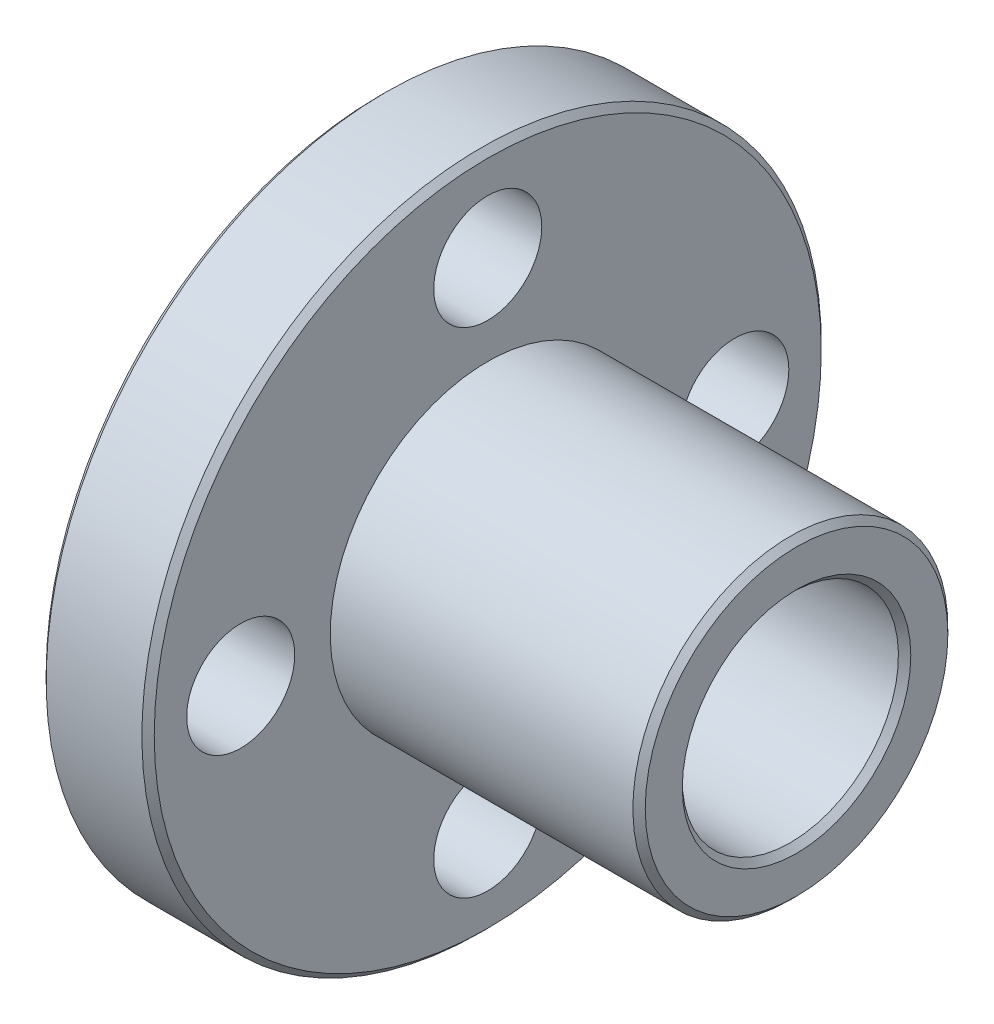
ISO-10303-21;
HEADER;
FILE_DESCRIPTION(('STEP AP214'),'2;1');
FILE_NAME('part.step','',(''),(''),'','','');
FILE_SCHEMA(('AUTOMOTIVE_DESIGN { 1 0 10303 214 1 1 1 1 }'));
ENDSEC;
DATA;
#1=APPLICATION_CONTEXT('core data for automotive mechanical design processes');
#2=APPLICATION_PROTOCOL_DEFINITION('international standard','automotive_design',2000,#1);
#3=PRODUCT_CONTEXT('',#1,'mechanical');
#4=PRODUCT('Part','Part','',(#3));
#5=PRODUCT_RELATED_PRODUCT_CATEGORY('part','',(#4));
#6=PRODUCT_DEFINITION_FORMATION('','',#4);
#7=PRODUCT_DEFINITION_CONTEXT('part definition',#1,'design');
#8=PRODUCT_DEFINITION('design','',#6,#7);
#9=PRODUCT_DEFINITION_SHAPE('','',#8);
#10=(LENGTH_UNIT() NAMED_UNIT(*) SI_UNIT(.MILLI.,.METRE.));
#11=(NAMED_UNIT(*) PLANE_ANGLE_UNIT() SI_UNIT($,.RADIAN.));
#12=(NAMED_UNIT(*) SI_UNIT($,.STERADIAN.) SOLID_ANGLE_UNIT());
#13=UNCERTAINTY_MEASURE_WITH_UNIT(LENGTH_MEASURE(1.E-05),#10,'distance_accuracy_value','');
#14=(GEOMETRIC_REPRESENTATION_CONTEXT(3) GLOBAL_UNCERTAINTY_ASSIGNED_CONTEXT((#13)) GLOBAL_UNIT_ASSIGNED_CONTEXT((#10,
#11,#12)) REPRESENTATION_CONTEXT('',''));
#15=CARTESIAN_POINT('',(0.,0.,0.));
#16=DIRECTION('',(0.,0.,1.));
#17=DIRECTION('',(1.,0.,0.));
#18=AXIS2_PLACEMENT_3D('',#15,#16,#17);
#19=CARTESIAN_POINT('',(-1.5,5.1,0.));
#20=DIRECTION('',(1.,0.,0.));
#21=DIRECTION('',(0.,1.,0.));
#22=AXIS2_PLACEMENT_3D('',#19,#20,#21);
#23=PLANE('',#22);
#24=CARTESIAN_POINT('',(-1.5,0.,0.));
#25=DIRECTION('',(1.,0.,0.));
#26=DIRECTION('',(0.,1.,0.));
#27=AXIS2_PLACEMENT_3D('',#24,#25,#26);
#28=CIRCLE('',#27,3.69999999999999);
#29=CARTESIAN_POINT('',(-1.5,3.69999999999999,0.));
#30=VERTEX_POINT('',#29);
#31=EDGE_CURVE('E41',#30,#30,#28,.T.);
#32=ORIENTED_EDGE('',*,*,#31,.T.);
#33=EDGE_LOOP('',(#32));
#34=FACE_BOUND('',#33,.T.);
#35=CARTESIAN_POINT('',(-1.5,0.,0.));
#36=DIRECTION('',(1.,0.,0.));
#37=DIRECTION('',(0.,1.,0.));
#38=AXIS2_PLACEMENT_3D('',#35,#36,#37);
#39=CIRCLE('',#38,4.9);
#40=CARTESIAN_POINT('',(-1.5,4.9,0.));
#41=VERTEX_POINT('',#40);
#42=EDGE_CURVE('E46',#41,#41,#39,.F.);
#43=ORIENTED_EDGE('',*,*,#42,.T.);
#44=EDGE_LOOP('',(#43));
#45=FACE_BOUND('',#44,.T.);
#46=ADVANCED_FACE('F33',(#34,#45),#23,.F.);
#47=CARTESIAN_POINT('',(0.,0.,0.));
#48=DIRECTION('',(-1.,0.,0.));
#49=DIRECTION('',(0.,-1.,0.));
#50=AXIS2_PLACEMENT_3D('',#47,#48,#49);
#51=CYLINDRICAL_SURFACE('',#50,5.1);
#52=CARTESIAN_POINT('',(-1.3,0.,0.));
#53=DIRECTION('',(1.,0.,0.));
#54=DIRECTION('',(0.,1.,0.));
#55=AXIS2_PLACEMENT_3D('',#52,#53,#54);
#56=CIRCLE('',#55,5.1);
#57=CARTESIAN_POINT('',(-1.3,5.1,0.));
#58=VERTEX_POINT('',#57);
#59=EDGE_CURVE('E10',#58,#58,#56,.T.);
#60=ORIENTED_EDGE('',*,*,#59,.T.);
#61=EDGE_LOOP('',(#60));
#62=FACE_BOUND('',#61,.T.);
#63=CARTESIAN_POINT('',(0.,0.,0.));
#64=DIRECTION('',(-1.,0.,0.));
#65=DIRECTION('',(0.,-1.,0.));
#66=AXIS2_PLACEMENT_3D('',#63,#64,#65);
#67=CIRCLE('',#66,5.1);
#68=CARTESIAN_POINT('',(0.,-5.1,0.));
#69=VERTEX_POINT('',#68);
#70=EDGE_CURVE('E84',#69,#69,#67,.T.);
#71=ORIENTED_EDGE('',*,*,#70,.T.);
#72=EDGE_LOOP('',(#71));
#73=FACE_BOUND('',#72,.T.);
#74=ADVANCED_FACE('F131',(#62,#73),#51,.T.);
#75=CARTESIAN_POINT('',(0.,5.1,0.));
#76=DIRECTION('',(1.,0.,0.));
#77=DIRECTION('',(0.,1.,0.));
#78=AXIS2_PLACEMENT_3D('',#75,#76,#77);
#79=PLANE('',#78);
#80=CARTESIAN_POINT('',(0.,0.,8.));
#81=DIRECTION('',(1.,0.,0.));
#82=DIRECTION('',(0.,1.,0.));
#83=AXIS2_PLACEMENT_3D('',#80,#81,#82);
#84=CIRCLE('',#83,0.91786025882474);
#85=CARTESIAN_POINT('',(0.,0.917860258824824,8.));
#86=VERTEX_POINT('',#85);
#87=EDGE_CURVE('E37',#86,#86,#84,.T.);
#88=ORIENTED_EDGE('',*,*,#87,.T.);
#89=EDGE_LOOP('',(#88));
#90=FACE_BOUND('',#89,.T.);
#91=CARTESIAN_POINT('',(0.,-8.,0.));
#92=DIRECTION('',(1.,0.,0.));
#93=DIRECTION('',(0.,1.,0.));
#94=AXIS2_PLACEMENT_3D('',#91,#92,#93);
#95=CIRCLE('',#94,0.917860258824741);
#96=CARTESIAN_POINT('',(0.,-7.08213974117526,0.));
#97=VERTEX_POINT('',#96);
#98=EDGE_CURVE('E59',#97,#97,#95,.T.);
#99=ORIENTED_EDGE('',*,*,#98,.T.);
#100=EDGE_LOOP('',(#99));
#101=FACE_BOUND('',#100,.T.);
#102=CARTESIAN_POINT('',(0.,0.,-8.));
#103=DIRECTION('',(1.,0.,0.));
#104=DIRECTION('',(0.,1.,0.));
#105=AXIS2_PLACEMENT_3D('',#102,#103,#104);
#106=CIRCLE('',#105,0.91786025882474);
#107=CARTESIAN_POINT('',(0.,0.917860258824712,-8.));
#108=VERTEX_POINT('',#107);
#109=EDGE_CURVE('E55',#108,#108,#106,.T.);
#110=ORIENTED_EDGE('',*,*,#109,.T.);
#111=EDGE_LOOP('',(#110));
#112=FACE_BOUND('',#111,.T.);
#113=CARTESIAN_POINT('',(0.,8.,0.));
#114=DIRECTION('',(1.,0.,0.));
#115=DIRECTION('',(0.,1.,0.));
#116=AXIS2_PLACEMENT_3D('',#113,#114,#115);
#117=CIRCLE('',#116,0.917860258824741);
#118=CARTESIAN_POINT('',(0.,8.91786025882474,0.));
#119=VERTEX_POINT('',#118);
#120=EDGE_CURVE('E50',#119,#119,#117,.T.);
#121=ORIENTED_EDGE('',*,*,#120,.T.);
#122=EDGE_LOOP('',(#121));
#123=FACE_BOUND('',#122,.T.);
#124=CARTESIAN_POINT('',(0.,0.,0.));
#125=DIRECTION('',(1.,0.,0.));
#126=DIRECTION('',(0.,1.,0.));
#127=AXIS2_PLACEMENT_3D('',#124,#125,#126);
#128=CIRCLE('',#127,10.8);
#129=CARTESIAN_POINT('',(0.,10.8,0.));
#130=VERTEX_POINT('',#129);
#131=EDGE_CURVE('E111',#130,#130,#128,.F.);
#132=ORIENTED_EDGE('',*,*,#131,.T.);
#133=EDGE_LOOP('',(#132));
#134=FACE_BOUND('',#133,.T.);
#135=ORIENTED_EDGE('',*,*,#70,.F.);
#136=EDGE_LOOP('',(#135));
#137=FACE_BOUND('',#136,.T.);
#138=ADVANCED_FACE('F137',(#90,#101,#112,#123,#134,#137),#79,.F.);
#139=CARTESIAN_POINT('',(0.,0.,0.));
#140=DIRECTION('',(-1.,0.,0.));
#141=DIRECTION('',(0.,-1.,0.));
#142=AXIS2_PLACEMENT_3D('',#139,#140,#141);
#143=CYLINDRICAL_SURFACE('',#142,11.);
#144=CARTESIAN_POINT('',(3.3,0.,0.));
#145=DIRECTION('',(-1.,0.,0.));
#146=DIRECTION('',(0.,-1.,0.));
#147=AXIS2_PLACEMENT_3D('',#144,#145,#146);
#148=CIRCLE('',#147,11.);
#149=CARTESIAN_POINT('',(3.3,-11.,0.));
#150=VERTEX_POINT('',#149);
#151=EDGE_CURVE('E105',#150,#150,#148,.T.);
#152=ORIENTED_EDGE('',*,*,#151,.T.);
#153=EDGE_LOOP('',(#152));
#154=FACE_BOUND('',#153,.T.);
#155=CARTESIAN_POINT('',(0.200000000000009,0.,0.));
#156=DIRECTION('',(1.,0.,0.));
#157=DIRECTION('',(0.,1.,0.));
#158=AXIS2_PLACEMENT_3D('',#155,#156,#157);
#159=CIRCLE('',#158,11.);
#160=CARTESIAN_POINT('',(0.200000000000009,11.,0.));
#161=VERTEX_POINT('',#160);
#162=EDGE_CURVE('E102',#161,#161,#159,.T.);
#163=ORIENTED_EDGE('',*,*,#162,.T.);
#164=EDGE_LOOP('',(#163));
#165=FACE_BOUND('',#164,.T.);
#166=ADVANCED_FACE('F164',(#154,#165),#143,.T.);
#167=CARTESIAN_POINT('',(3.5,11.,0.));
#168=DIRECTION('',(-1.,0.,0.));
#169=DIRECTION('',(0.,-1.,0.));
#170=AXIS2_PLACEMENT_3D('',#167,#168,#169);
#171=PLANE('',#170);
#172=CARTESIAN_POINT('',(3.5,0.,8.));
#173=DIRECTION('',(1.,0.,0.));
#174=DIRECTION('',(0.,0.,-1.));
#175=AXIS2_PLACEMENT_3D('',#172,#173,#174);
#176=CIRCLE('',#175,1.75);
#177=CARTESIAN_POINT('',(3.5,0.,6.25));
#178=VERTEX_POINT('',#177);
#179=EDGE_CURVE('E223',#178,#178,#176,.T.);
#180=ORIENTED_EDGE('',*,*,#179,.F.);
#181=EDGE_LOOP('',(#180));
#182=FACE_BOUND('',#181,.T.);
#183=CARTESIAN_POINT('',(3.5,-8.,0.));
#184=DIRECTION('',(1.,0.,0.));
#185=DIRECTION('',(0.,0.,-1.));
#186=AXIS2_PLACEMENT_3D('',#183,#184,#185);
#187=CIRCLE('',#186,1.75);
#188=CARTESIAN_POINT('',(3.5,-8.,-1.75));
#189=VERTEX_POINT('',#188);
#190=EDGE_CURVE('E68',#189,#189,#187,.T.);
#191=ORIENTED_EDGE('',*,*,#190,.F.);
#192=EDGE_LOOP('',(#191));
#193=FACE_BOUND('',#192,.T.);
#194=CARTESIAN_POINT('',(3.5,0.,-8.));
#195=DIRECTION('',(1.,0.,0.));
#196=DIRECTION('',(0.,0.,-1.));
#197=AXIS2_PLACEMENT_3D('',#194,#195,#196);
#198=CIRCLE('',#197,1.75);
#199=CARTESIAN_POINT('',(3.5,0.,-9.75));
#200=VERTEX_POINT('',#199);
#201=EDGE_CURVE('E61',#200,#200,#198,.T.);
#202=ORIENTED_EDGE('',*,*,#201,.F.);
#203=EDGE_LOOP('',(#202));
#204=FACE_BOUND('',#203,.T.);
#205=CARTESIAN_POINT('',(3.5,8.,0.));
#206=DIRECTION('',(1.,0.,0.));
#207=DIRECTION('',(0.,0.,-1.));
#208=AXIS2_PLACEMENT_3D('',#205,#206,#207);
#209=CIRCLE('',#208,1.75);
#210=CARTESIAN_POINT('',(3.5,8.,-1.75));
#211=VERTEX_POINT('',#210);
#212=EDGE_CURVE('E57',#211,#211,#209,.T.);
#213=ORIENTED_EDGE('',*,*,#212,.F.);
#214=EDGE_LOOP('',(#213));
#215=FACE_BOUND('',#214,.T.);
#216=CARTESIAN_POINT('',(3.5,0.,0.));
#217=DIRECTION('',(-1.,0.,0.));
#218=DIRECTION('',(0.,-1.,0.));
#219=AXIS2_PLACEMENT_3D('',#216,#217,#218);
#220=CIRCLE('',#219,10.8);
#221=CARTESIAN_POINT('',(3.5,-10.8,0.));
#222=VERTEX_POINT('',#221);
#223=EDGE_CURVE('E108',#222,#222,#220,.F.);
#224=ORIENTED_EDGE('',*,*,#223,.T.);
#225=EDGE_LOOP('',(#224));
#226=FACE_BOUND('',#225,.T.);
#227=CARTESIAN_POINT('',(3.5,0.,0.));
#228=DIRECTION('',(-1.,0.,0.));
#229=DIRECTION('',(0.,-1.,0.));
#230=AXIS2_PLACEMENT_3D('',#227,#228,#229);
#231=CIRCLE('',#230,5.1);
#232=CARTESIAN_POINT('',(3.5,-5.1,0.));
#233=VERTEX_POINT('',#232);
#234=EDGE_CURVE('E53',#233,#233,#231,.T.);
#235=ORIENTED_EDGE('',*,*,#234,.T.);
#236=EDGE_LOOP('',(#235));
#237=FACE_BOUND('',#236,.T.);
#238=ADVANCED_FACE('F171',(#182,#193,#204,#215,#226,#237),#171,.F.);
#239=CARTESIAN_POINT('',(0.,0.,0.));
#240=DIRECTION('',(-1.,0.,0.));
#241=DIRECTION('',(0.,-1.,0.));
#242=AXIS2_PLACEMENT_3D('',#239,#240,#241);
#243=CYLINDRICAL_SURFACE('',#242,5.1);
#244=CARTESIAN_POINT('',(13.3,0.,0.));
#245=DIRECTION('',(-1.,0.,0.));
#246=DIRECTION('',(0.,-1.,0.));
#247=AXIS2_PLACEMENT_3D('',#244,#245,#246);
#248=CIRCLE('',#247,5.1);
#249=CARTESIAN_POINT('',(13.3,-5.1,0.));
#250=VERTEX_POINT('',#249);
#251=EDGE_CURVE('E99',#250,#250,#248,.T.);
#252=ORIENTED_EDGE('',*,*,#251,.T.);
#253=EDGE_LOOP('',(#252));
#254=FACE_BOUND('',#253,.T.);
#255=ORIENTED_EDGE('',*,*,#234,.F.);
#256=EDGE_LOOP('',(#255));
#257=FACE_BOUND('',#256,.T.);
#258=ADVANCED_FACE('F178',(#254,#257),#243,.T.);
#259=CARTESIAN_POINT('',(13.5,5.1,0.));
#260=DIRECTION('',(-1.,0.,0.));
#261=DIRECTION('',(0.,-1.,0.));
#262=AXIS2_PLACEMENT_3D('',#259,#260,#261);
#263=PLANE('',#262);
#264=CARTESIAN_POINT('',(13.5,0.,0.));
#265=DIRECTION('',(-1.,0.,0.));
#266=DIRECTION('',(0.,-1.,0.));
#267=AXIS2_PLACEMENT_3D('',#264,#265,#266);
#268=CIRCLE('',#267,3.7);
#269=CARTESIAN_POINT('',(13.5,-3.7,0.));
#270=VERTEX_POINT('',#269);
#271=EDGE_CURVE('E90',#270,#270,#268,.T.);
#272=ORIENTED_EDGE('',*,*,#271,.T.);
#273=EDGE_LOOP('',(#272));
#274=FACE_BOUND('',#273,.T.);
#275=CARTESIAN_POINT('',(13.5,0.,0.));
#276=DIRECTION('',(-1.,0.,0.));
#277=DIRECTION('',(0.,-1.,0.));
#278=AXIS2_PLACEMENT_3D('',#275,#276,#277);
#279=CIRCLE('',#278,4.9);
#280=CARTESIAN_POINT('',(13.5,-4.9,0.));
#281=VERTEX_POINT('',#280);
#282=EDGE_CURVE('E87',#281,#281,#279,.F.);
#283=ORIENTED_EDGE('',*,*,#282,.T.);
#284=EDGE_LOOP('',(#283));
#285=FACE_BOUND('',#284,.T.);
#286=ADVANCED_FACE('F182',(#274,#285),#263,.F.);
#287=CARTESIAN_POINT('',(0.,0.,0.));
#288=DIRECTION('',(-1.,0.,0.));
#289=DIRECTION('',(0.,-1.,0.));
#290=AXIS2_PLACEMENT_3D('',#287,#288,#289);
#291=CYLINDRICAL_SURFACE('',#290,3.5);
#292=CARTESIAN_POINT('',(13.3,0.,0.));
#293=DIRECTION('',(-1.,0.,0.));
#294=DIRECTION('',(0.,-1.,0.));
#295=AXIS2_PLACEMENT_3D('',#292,#293,#294);
#296=CIRCLE('',#295,3.5);
#297=CARTESIAN_POINT('',(13.3,-3.5,0.));
#298=VERTEX_POINT('',#297);
#299=EDGE_CURVE('E96',#298,#298,#296,.F.);
#300=ORIENTED_EDGE('',*,*,#299,.T.);
#301=EDGE_LOOP('',(#300));
#302=FACE_BOUND('',#301,.T.);
#303=CARTESIAN_POINT('',(-1.30000000000001,0.,0.));
#304=DIRECTION('',(1.,0.,0.));
#305=DIRECTION('',(0.,1.,0.));
#306=AXIS2_PLACEMENT_3D('',#303,#304,#305);
#307=CIRCLE('',#306,3.5);
#308=CARTESIAN_POINT('',(-1.30000000000001,3.5,0.));
#309=VERTEX_POINT('',#308);
#310=EDGE_CURVE('E93',#309,#309,#307,.F.);
#311=ORIENTED_EDGE('',*,*,#310,.T.);
#312=EDGE_LOOP('',(#311));
#313=FACE_BOUND('',#312,.T.);
#314=ADVANCED_FACE('F145',(#302,#313),#291,.F.);
#315=CARTESIAN_POINT('',(13.5,0.,0.));
#316=DIRECTION('',(1.,0.,0.));
#317=DIRECTION('',(0.,1.,0.));
#318=AXIS2_PLACEMENT_3D('',#315,#316,#317);
#319=CONICAL_SURFACE('',#318,3.7,0.785398163397441);
#320=ORIENTED_EDGE('',*,*,#299,.F.);
#321=EDGE_LOOP('',(#320));
#322=FACE_BOUND('',#321,.T.);
#323=ORIENTED_EDGE('',*,*,#271,.F.);
#324=EDGE_LOOP('',(#323));
#325=FACE_BOUND('',#324,.T.);
#326=ADVANCED_FACE('F141',(#322,#325),#319,.F.);
#327=CARTESIAN_POINT('',(13.3,0.,0.));
#328=DIRECTION('',(-1.,0.,0.));
#329=DIRECTION('',(0.,-1.,0.));
#330=AXIS2_PLACEMENT_3D('',#327,#328,#329);
#331=CONICAL_SURFACE('',#330,5.1,0.785398163397438);
#332=ORIENTED_EDGE('',*,*,#282,.F.);
#333=EDGE_LOOP('',(#332));
#334=FACE_BOUND('',#333,.T.);
#335=ORIENTED_EDGE('',*,*,#251,.F.);
#336=EDGE_LOOP('',(#335));
#337=FACE_BOUND('',#336,.T.);
#338=ADVANCED_FACE('F144',(#334,#337),#331,.T.);
#339=CARTESIAN_POINT('',(3.3,0.,0.));
#340=DIRECTION('',(-1.,0.,0.));
#341=DIRECTION('',(0.,-1.,0.));
#342=AXIS2_PLACEMENT_3D('',#339,#340,#341);
#343=CONICAL_SURFACE('',#342,11.,0.785398163397457);
#344=ORIENTED_EDGE('',*,*,#223,.F.);
#345=EDGE_LOOP('',(#344));
#346=FACE_BOUND('',#345,.T.);
#347=ORIENTED_EDGE('',*,*,#151,.F.);
#348=EDGE_LOOP('',(#347));
#349=FACE_BOUND('',#348,.T.);
#350=ADVANCED_FACE('F149',(#346,#349),#343,.T.);
#351=CARTESIAN_POINT('',(0.,0.,0.));
#352=DIRECTION('',(1.,0.,0.));
#353=DIRECTION('',(0.,1.,0.));
#354=AXIS2_PLACEMENT_3D('',#351,#352,#353);
#355=CONICAL_SURFACE('',#354,10.8,0.785398163397448);
#356=ORIENTED_EDGE('',*,*,#162,.F.);
#357=EDGE_LOOP('',(#356));
#358=FACE_BOUND('',#357,.T.);
#359=ORIENTED_EDGE('',*,*,#131,.F.);
#360=EDGE_LOOP('',(#359));
#361=FACE_BOUND('',#360,.T.);
#362=ADVANCED_FACE('F128',(#358,#361),#355,.T.);
#363=CARTESIAN_POINT('',(-1.30000000000001,0.,0.));
#364=DIRECTION('',(-1.,0.,0.));
#365=DIRECTION('',(0.,-1.,0.));
#366=AXIS2_PLACEMENT_3D('',#363,#364,#365);
#367=CONICAL_SURFACE('',#366,3.5,0.785398163397455);
#368=ORIENTED_EDGE('',*,*,#31,.F.);
#369=EDGE_LOOP('',(#368));
#370=FACE_BOUND('',#369,.T.);
#371=ORIENTED_EDGE('',*,*,#310,.F.);
#372=EDGE_LOOP('',(#371));
#373=FACE_BOUND('',#372,.T.);
#374=ADVANCED_FACE('F119',(#370,#373),#367,.F.);
#375=CARTESIAN_POINT('',(-1.5,0.,0.));
#376=DIRECTION('',(1.,0.,0.));
#377=DIRECTION('',(0.,1.,0.));
#378=AXIS2_PLACEMENT_3D('',#375,#376,#377);
#379=CONICAL_SURFACE('',#378,4.9,0.78539816339745);
#380=ORIENTED_EDGE('',*,*,#59,.F.);
#381=EDGE_LOOP('',(#380));
#382=FACE_BOUND('',#381,.T.);
#383=ORIENTED_EDGE('',*,*,#42,.F.);
#384=EDGE_LOOP('',(#383));
#385=FACE_BOUND('',#384,.T.);
#386=ADVANCED_FACE('F35',(#382,#385),#379,.T.);
#387=CARTESIAN_POINT('',(0.5,8.,0.));
#388=DIRECTION('',(1.,0.,0.));
#389=DIRECTION('',(0.,0.,-1.));
#390=AXIS2_PLACEMENT_3D('',#387,#388,#389);
#391=CONICAL_SURFACE('',#390,1.75,1.02974425867665);
#392=CARTESIAN_POINT('',(0.5,8.,0.));
#393=DIRECTION('',(1.,0.,0.));
#394=DIRECTION('',(0.,0.,-1.));
#395=AXIS2_PLACEMENT_3D('',#392,#393,#394);
#396=CIRCLE('',#395,1.75);
#397=CARTESIAN_POINT('',(0.5,8.,-1.75));
#398=VERTEX_POINT('',#397);
#399=EDGE_CURVE('E54',#398,#398,#396,.T.);
#400=ORIENTED_EDGE('',*,*,#399,.T.);
#401=EDGE_LOOP('',(#400));
#402=FACE_BOUND('',#401,.T.);
#403=ORIENTED_EDGE('',*,*,#120,.F.);
#404=EDGE_LOOP('',(#403));
#405=FACE_BOUND('',#404,.T.);
#406=ADVANCED_FACE('F118',(#402,#405),#391,.F.);
#407=CARTESIAN_POINT('',(3.5,8.,0.));
#408=DIRECTION('',(1.,0.,0.));
#409=DIRECTION('',(0.,0.,-1.));
#410=AXIS2_PLACEMENT_3D('',#407,#408,#409);
#411=CYLINDRICAL_SURFACE('',#410,1.75);
#412=ORIENTED_EDGE('',*,*,#399,.F.);
#413=EDGE_LOOP('',(#412));
#414=FACE_BOUND('',#413,.T.);
#415=ORIENTED_EDGE('',*,*,#212,.T.);
#416=EDGE_LOOP('',(#415));
#417=FACE_BOUND('',#416,.T.);
#418=ADVANCED_FACE('F125',(#414,#417),#411,.F.);
#419=CARTESIAN_POINT('',(0.5,0.,-8.));
#420=DIRECTION('',(1.,0.,0.));
#421=DIRECTION('',(0.,0.,-1.));
#422=AXIS2_PLACEMENT_3D('',#419,#420,#421);
#423=CONICAL_SURFACE('',#422,1.75,1.02974425867665);
#424=CARTESIAN_POINT('',(0.5,0.,-8.));
#425=DIRECTION('',(1.,0.,0.));
#426=DIRECTION('',(0.,0.,-1.));
#427=AXIS2_PLACEMENT_3D('',#424,#425,#426);
#428=CIRCLE('',#427,1.75);
#429=CARTESIAN_POINT('',(0.5,0.,-9.75));
#430=VERTEX_POINT('',#429);
#431=EDGE_CURVE('E58',#430,#430,#428,.T.);
#432=ORIENTED_EDGE('',*,*,#431,.T.);
#433=EDGE_LOOP('',(#432));
#434=FACE_BOUND('',#433,.T.);
#435=ORIENTED_EDGE('',*,*,#109,.F.);
#436=EDGE_LOOP('',(#435));
#437=FACE_BOUND('',#436,.T.);
#438=ADVANCED_FACE('F192',(#434,#437),#423,.F.);
#439=CARTESIAN_POINT('',(3.5,0.,-8.));
#440=DIRECTION('',(1.,0.,0.));
#441=DIRECTION('',(0.,0.,-1.));
#442=AXIS2_PLACEMENT_3D('',#439,#440,#441);
#443=CYLINDRICAL_SURFACE('',#442,1.75);
#444=ORIENTED_EDGE('',*,*,#431,.F.);
#445=EDGE_LOOP('',(#444));
#446=FACE_BOUND('',#445,.T.);
#447=ORIENTED_EDGE('',*,*,#201,.T.);
#448=EDGE_LOOP('',(#447));
#449=FACE_BOUND('',#448,.T.);
#450=ADVANCED_FACE('F196',(#446,#449),#443,.F.);
#451=CARTESIAN_POINT('',(0.5,-8.,0.));
#452=DIRECTION('',(1.,0.,0.));
#453=DIRECTION('',(0.,0.,-1.));
#454=AXIS2_PLACEMENT_3D('',#451,#452,#453);
#455=CONICAL_SURFACE('',#454,1.75,1.02974425867665);
#456=CARTESIAN_POINT('',(0.5,-8.,0.));
#457=DIRECTION('',(1.,0.,0.));
#458=DIRECTION('',(0.,0.,-1.));
#459=AXIS2_PLACEMENT_3D('',#456,#457,#458);
#460=CIRCLE('',#459,1.75);
#461=CARTESIAN_POINT('',(0.5,-8.,-1.75));
#462=VERTEX_POINT('',#461);
#463=EDGE_CURVE('E62',#462,#462,#460,.T.);
#464=ORIENTED_EDGE('',*,*,#463,.T.);
#465=EDGE_LOOP('',(#464));
#466=FACE_BOUND('',#465,.T.);
#467=ORIENTED_EDGE('',*,*,#98,.F.);
#468=EDGE_LOOP('',(#467));
#469=FACE_BOUND('',#468,.T.);
#470=ADVANCED_FACE('F200',(#466,#469),#455,.F.);
#471=CARTESIAN_POINT('',(3.5,-8.,0.));
#472=DIRECTION('',(1.,0.,0.));
#473=DIRECTION('',(0.,0.,-1.));
#474=AXIS2_PLACEMENT_3D('',#471,#472,#473);
#475=CYLINDRICAL_SURFACE('',#474,1.75);
#476=ORIENTED_EDGE('',*,*,#463,.F.);
#477=EDGE_LOOP('',(#476));
#478=FACE_BOUND('',#477,.T.);
#479=ORIENTED_EDGE('',*,*,#190,.T.);
#480=EDGE_LOOP('',(#479));
#481=FACE_BOUND('',#480,.T.);
#482=ADVANCED_FACE('F204',(#478,#481),#475,.F.);
#483=CARTESIAN_POINT('',(0.5,0.,8.));
#484=DIRECTION('',(1.,0.,0.));
#485=DIRECTION('',(0.,0.,-1.));
#486=AXIS2_PLACEMENT_3D('',#483,#484,#485);
#487=CONICAL_SURFACE('',#486,1.75,1.02974425867665);
#488=CARTESIAN_POINT('',(0.5,0.,8.));
#489=DIRECTION('',(1.,0.,0.));
#490=DIRECTION('',(0.,0.,-1.));
#491=AXIS2_PLACEMENT_3D('',#488,#489,#490);
#492=CIRCLE('',#491,1.75);
#493=CARTESIAN_POINT('',(0.5,0.,6.25));
#494=VERTEX_POINT('',#493);
#495=EDGE_CURVE('E220',#494,#494,#492,.T.);
#496=ORIENTED_EDGE('',*,*,#495,.T.);
#497=EDGE_LOOP('',(#496));
#498=FACE_BOUND('',#497,.T.);
#499=ORIENTED_EDGE('',*,*,#87,.F.);
#500=EDGE_LOOP('',(#499));
#501=FACE_BOUND('',#500,.T.);
#502=ADVANCED_FACE('F207',(#498,#501),#487,.F.);
#503=CARTESIAN_POINT('',(3.5,0.,8.));
#504=DIRECTION('',(1.,0.,0.));
#505=DIRECTION('',(0.,0.,-1.));
#506=AXIS2_PLACEMENT_3D('',#503,#504,#505);
#507=CYLINDRICAL_SURFACE('',#506,1.75);
#508=ORIENTED_EDGE('',*,*,#495,.F.);
#509=EDGE_LOOP('',(#508));
#510=FACE_BOUND('',#509,.T.);
#511=ORIENTED_EDGE('',*,*,#179,.T.);
#512=EDGE_LOOP('',(#511));
#513=FACE_BOUND('',#512,.T.);
#514=ADVANCED_FACE('F211',(#510,#513),#507,.F.);
#515=CLOSED_SHELL('',(#46,#74,#138,#166,#238,#258,#286,#314,#326,#338,#350,#362,#374,#386,#406,
#418,#438,#450,#470,#482,#502,#514));
#516=MANIFOLD_SOLID_BREP('B2',#515);
#517=ADVANCED_BREP_SHAPE_REPRESENTATION('',(#18,#516),#14);
#518=SHAPE_DEFINITION_REPRESENTATION(#9,#517);
ENDSEC;
END-ISO-10303-21;
